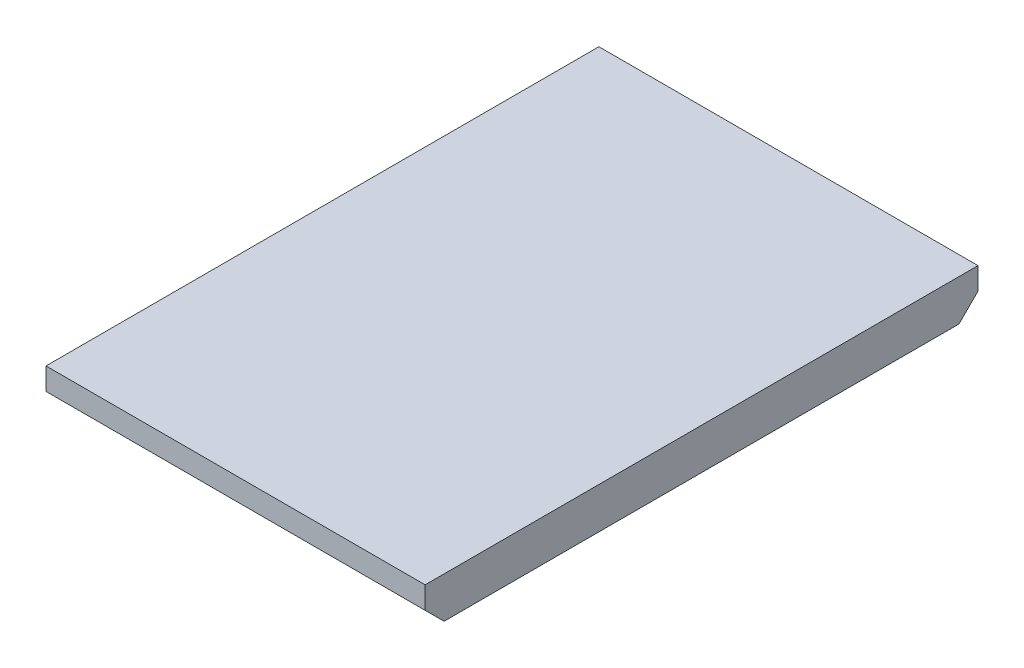
ISO-10303-21;
HEADER;
FILE_DESCRIPTION(('STEP AP214'),'2;1');
FILE_NAME('part.step','',(''),(''),'','','');
FILE_SCHEMA(('AUTOMOTIVE_DESIGN { 1 0 10303 214 1 1 1 1 }'));
ENDSEC;
DATA;
#1=APPLICATION_CONTEXT('core data for automotive mechanical design processes');
#2=APPLICATION_PROTOCOL_DEFINITION('international standard','automotive_design',2000,#1);
#3=PRODUCT_CONTEXT('',#1,'mechanical');
#4=PRODUCT('Part','Part','',(#3));
#5=PRODUCT_RELATED_PRODUCT_CATEGORY('part','',(#4));
#6=PRODUCT_DEFINITION_FORMATION('','',#4);
#7=PRODUCT_DEFINITION_CONTEXT('part definition',#1,'design');
#8=PRODUCT_DEFINITION('design','',#6,#7);
#9=PRODUCT_DEFINITION_SHAPE('','',#8);
#10=(LENGTH_UNIT() NAMED_UNIT(*) SI_UNIT(.MILLI.,.METRE.));
#11=(NAMED_UNIT(*) PLANE_ANGLE_UNIT() SI_UNIT($,.RADIAN.));
#12=(NAMED_UNIT(*) SI_UNIT($,.STERADIAN.) SOLID_ANGLE_UNIT());
#13=UNCERTAINTY_MEASURE_WITH_UNIT(LENGTH_MEASURE(1.E-05),#10,'distance_accuracy_value','');
#14=(GEOMETRIC_REPRESENTATION_CONTEXT(3) GLOBAL_UNCERTAINTY_ASSIGNED_CONTEXT((#13)) GLOBAL_UNIT_ASSIGNED_CONTEXT((#10,
#11,#12)) REPRESENTATION_CONTEXT('',''));
#15=CARTESIAN_POINT('',(0.,0.,0.));
#16=DIRECTION('',(0.,0.,1.));
#17=DIRECTION('',(1.,0.,0.));
#18=AXIS2_PLACEMENT_3D('',#15,#16,#17);
#19=CARTESIAN_POINT('',(12.,-1.4,-17.5));
#20=DIRECTION('',(0.,0.,1.));
#21=DIRECTION('',(1.,0.,0.));
#22=AXIS2_PLACEMENT_3D('',#19,#20,#21);
#23=PLANE('',#22);
#24=DIRECTION('',(0.,1.,0.));
#25=VECTOR('',#24,1.);
#26=CARTESIAN_POINT('',(-12.,-1.4,-17.5));
#27=LINE('',#26,#25);
#28=CARTESIAN_POINT('',(-12.,-1.4,-17.5));
#29=VERTEX_POINT('',#28);
#30=CARTESIAN_POINT('',(-12.,0.,-17.5));
#31=VERTEX_POINT('',#30);
#32=EDGE_CURVE('E121',#29,#31,#27,.T.);
#33=ORIENTED_EDGE('',*,*,#32,.T.);
#34=DIRECTION('',(-1.,0.,0.));
#35=VECTOR('',#34,1.);
#36=CARTESIAN_POINT('',(12.,0.,-17.5));
#37=LINE('',#36,#35);
#38=CARTESIAN_POINT('',(12.,0.,-17.5));
#39=VERTEX_POINT('',#38);
#40=EDGE_CURVE('E11',#39,#31,#37,.T.);
#41=ORIENTED_EDGE('',*,*,#40,.F.);
#42=DIRECTION('',(0.,1.,0.));
#43=VECTOR('',#42,1.);
#44=CARTESIAN_POINT('',(12.,-1.4,-17.5));
#45=LINE('',#44,#43);
#46=CARTESIAN_POINT('',(12.,-1.4,-17.5));
#47=VERTEX_POINT('',#46);
#48=EDGE_CURVE('E131',#47,#39,#45,.T.);
#49=ORIENTED_EDGE('',*,*,#48,.F.);
#50=DIRECTION('',(-1.,0.,0.));
#51=VECTOR('',#50,1.);
#52=CARTESIAN_POINT('',(12.,-1.4,-17.5));
#53=LINE('',#52,#51);
#54=EDGE_CURVE('E117',#47,#29,#53,.T.);
#55=ORIENTED_EDGE('',*,*,#54,.T.);
#56=EDGE_LOOP('',(#33,#41,#49,#55));
#57=FACE_BOUND('',#56,.T.);
#58=ADVANCED_FACE('F37',(#57),#23,.F.);
#59=CARTESIAN_POINT('',(12.,0.,-17.5));
#60=DIRECTION('',(0.,-1.,0.));
#61=DIRECTION('',(0.,0.,-1.));
#62=AXIS2_PLACEMENT_3D('',#59,#60,#61);
#63=PLANE('',#62);
#64=DIRECTION('',(0.,0.,1.));
#65=VECTOR('',#64,1.);
#66=CARTESIAN_POINT('',(-12.,0.,-17.5));
#67=LINE('',#66,#65);
#68=CARTESIAN_POINT('',(-12.,0.,17.5));
#69=VERTEX_POINT('',#68);
#70=EDGE_CURVE('E124',#31,#69,#67,.T.);
#71=ORIENTED_EDGE('',*,*,#70,.T.);
#72=DIRECTION('',(-1.,0.,0.));
#73=VECTOR('',#72,1.);
#74=CARTESIAN_POINT('',(12.,0.,17.5));
#75=LINE('',#74,#73);
#76=CARTESIAN_POINT('',(12.,0.,17.5));
#77=VERTEX_POINT('',#76);
#78=EDGE_CURVE('E45',#77,#69,#75,.T.);
#79=ORIENTED_EDGE('',*,*,#78,.F.);
#80=DIRECTION('',(0.,0.,1.));
#81=VECTOR('',#80,1.);
#82=CARTESIAN_POINT('',(12.,0.,-17.5));
#83=LINE('',#82,#81);
#84=EDGE_CURVE('E90',#39,#77,#83,.T.);
#85=ORIENTED_EDGE('',*,*,#84,.F.);
#86=ORIENTED_EDGE('',*,*,#40,.T.);
#87=EDGE_LOOP('',(#71,#79,#85,#86));
#88=FACE_BOUND('',#87,.T.);
#89=ADVANCED_FACE('F155',(#88),#63,.F.);
#90=CARTESIAN_POINT('',(12.,0.,17.5));
#91=DIRECTION('',(0.,0.,-1.));
#92=DIRECTION('',(-1.,0.,0.));
#93=AXIS2_PLACEMENT_3D('',#90,#91,#92);
#94=PLANE('',#93);
#95=DIRECTION('',(0.,-1.,0.));
#96=VECTOR('',#95,1.);
#97=CARTESIAN_POINT('',(-12.,0.,17.5));
#98=LINE('',#97,#96);
#99=CARTESIAN_POINT('',(-12.,-1.4,17.5));
#100=VERTEX_POINT('',#99);
#101=EDGE_CURVE('E126',#69,#100,#98,.T.);
#102=ORIENTED_EDGE('',*,*,#101,.T.);
#103=DIRECTION('',(-1.,0.,0.));
#104=VECTOR('',#103,1.);
#105=CARTESIAN_POINT('',(12.,-1.4,17.5));
#106=LINE('',#105,#104);
#107=CARTESIAN_POINT('',(12.,-1.4,17.5));
#108=VERTEX_POINT('',#107);
#109=EDGE_CURVE('E112',#108,#100,#106,.T.);
#110=ORIENTED_EDGE('',*,*,#109,.F.);
#111=DIRECTION('',(0.,-1.,0.));
#112=VECTOR('',#111,1.);
#113=CARTESIAN_POINT('',(12.,0.,17.5));
#114=LINE('',#113,#112);
#115=EDGE_CURVE('E103',#77,#108,#114,.T.);
#116=ORIENTED_EDGE('',*,*,#115,.F.);
#117=ORIENTED_EDGE('',*,*,#78,.T.);
#118=EDGE_LOOP('',(#102,#110,#116,#117));
#119=FACE_BOUND('',#118,.T.);
#120=ADVANCED_FACE('F137',(#119),#94,.F.);
#121=CARTESIAN_POINT('',(12.,-1.4,17.5));
#122=DIRECTION('',(0.,0.707106781186548,-0.707106781186548));
#123=DIRECTION('',(0.,0.707106781186548,0.707106781186548));
#124=AXIS2_PLACEMENT_3D('',#121,#122,#123);
#125=PLANE('',#124);
#126=DIRECTION('',(0.,-0.707106781186547,-0.707106781186547));
#127=VECTOR('',#126,1.);
#128=CARTESIAN_POINT('',(-12.,-1.4,17.5));
#129=LINE('',#128,#127);
#130=CARTESIAN_POINT('',(-12.,-2.6,16.3));
#131=VERTEX_POINT('',#130);
#132=EDGE_CURVE('E111',#100,#131,#129,.T.);
#133=ORIENTED_EDGE('',*,*,#132,.T.);
#134=DIRECTION('',(-1.,0.,0.));
#135=VECTOR('',#134,1.);
#136=CARTESIAN_POINT('',(12.,-2.6,16.3));
#137=LINE('',#136,#135);
#138=CARTESIAN_POINT('',(12.,-2.6,16.3));
#139=VERTEX_POINT('',#138);
#140=EDGE_CURVE('E108',#139,#131,#137,.T.);
#141=ORIENTED_EDGE('',*,*,#140,.F.);
#142=DIRECTION('',(0.,-0.707106781186547,-0.707106781186547));
#143=VECTOR('',#142,1.);
#144=CARTESIAN_POINT('',(12.,-1.4,17.5));
#145=LINE('',#144,#143);
#146=EDGE_CURVE('E97',#108,#139,#145,.T.);
#147=ORIENTED_EDGE('',*,*,#146,.F.);
#148=ORIENTED_EDGE('',*,*,#109,.T.);
#149=EDGE_LOOP('',(#133,#141,#147,#148));
#150=FACE_BOUND('',#149,.T.);
#151=ADVANCED_FACE('F109',(#150),#125,.F.);
#152=CARTESIAN_POINT('',(12.,-2.6,16.3));
#153=DIRECTION('',(0.,1.,0.));
#154=DIRECTION('',(0.,0.,1.));
#155=AXIS2_PLACEMENT_3D('',#152,#153,#154);
#156=PLANE('',#155);
#157=DIRECTION('',(0.,0.,-1.));
#158=VECTOR('',#157,1.);
#159=CARTESIAN_POINT('',(-12.,-2.6,16.3));
#160=LINE('',#159,#158);
#161=CARTESIAN_POINT('',(-12.,-2.6,-16.3));
#162=VERTEX_POINT('',#161);
#163=EDGE_CURVE('E76',#131,#162,#160,.T.);
#164=ORIENTED_EDGE('',*,*,#163,.T.);
#165=DIRECTION('',(-1.,0.,0.));
#166=VECTOR('',#165,1.);
#167=CARTESIAN_POINT('',(12.,-2.6,-16.3));
#168=LINE('',#167,#166);
#169=CARTESIAN_POINT('',(12.,-2.6,-16.3));
#170=VERTEX_POINT('',#169);
#171=EDGE_CURVE('E113',#170,#162,#168,.T.);
#172=ORIENTED_EDGE('',*,*,#171,.F.);
#173=DIRECTION('',(0.,0.,-1.));
#174=VECTOR('',#173,1.);
#175=CARTESIAN_POINT('',(12.,-2.6,16.3));
#176=LINE('',#175,#174);
#177=EDGE_CURVE('E101',#139,#170,#176,.T.);
#178=ORIENTED_EDGE('',*,*,#177,.F.);
#179=ORIENTED_EDGE('',*,*,#140,.T.);
#180=EDGE_LOOP('',(#164,#172,#178,#179));
#181=FACE_BOUND('',#180,.T.);
#182=ADVANCED_FACE('F115',(#181),#156,.F.);
#183=CARTESIAN_POINT('',(12.,-2.6,-16.3));
#184=DIRECTION('',(0.,0.707106781186548,0.707106781186548));
#185=DIRECTION('',(0.,-0.707106781186548,0.707106781186548));
#186=AXIS2_PLACEMENT_3D('',#183,#184,#185);
#187=PLANE('',#186);
#188=DIRECTION('',(0.,0.707106781186547,-0.707106781186547));
#189=VECTOR('',#188,1.);
#190=CARTESIAN_POINT('',(-12.,-2.6,-16.3));
#191=LINE('',#190,#189);
#192=EDGE_CURVE('E82',#162,#29,#191,.T.);
#193=ORIENTED_EDGE('',*,*,#192,.T.);
#194=ORIENTED_EDGE('',*,*,#54,.F.);
#195=DIRECTION('',(0.,0.707106781186547,-0.707106781186547));
#196=VECTOR('',#195,1.);
#197=CARTESIAN_POINT('',(12.,-2.6,-16.3));
#198=LINE('',#197,#196);
#199=EDGE_CURVE('E53',#170,#47,#198,.T.);
#200=ORIENTED_EDGE('',*,*,#199,.F.);
#201=ORIENTED_EDGE('',*,*,#171,.T.);
#202=EDGE_LOOP('',(#193,#194,#200,#201));
#203=FACE_BOUND('',#202,.T.);
#204=ADVANCED_FACE('F144',(#203),#187,.F.);
#205=CARTESIAN_POINT('',(12.,0.,0.));
#206=DIRECTION('',(1.,0.,0.));
#207=DIRECTION('',(0.,0.,-1.));
#208=AXIS2_PLACEMENT_3D('',#205,#206,#207);
#209=PLANE('',#208);
#210=ORIENTED_EDGE('',*,*,#48,.T.);
#211=ORIENTED_EDGE('',*,*,#84,.T.);
#212=ORIENTED_EDGE('',*,*,#115,.T.);
#213=ORIENTED_EDGE('',*,*,#146,.T.);
#214=ORIENTED_EDGE('',*,*,#177,.T.);
#215=ORIENTED_EDGE('',*,*,#199,.T.);
#216=EDGE_LOOP('',(#210,#211,#212,#213,#214,#215));
#217=FACE_BOUND('',#216,.T.);
#218=ADVANCED_FACE('F99',(#217),#209,.T.);
#219=CARTESIAN_POINT('',(-12.,0.,0.));
#220=DIRECTION('',(1.,0.,0.));
#221=DIRECTION('',(0.,0.,-1.));
#222=AXIS2_PLACEMENT_3D('',#219,#220,#221);
#223=PLANE('',#222);
#224=ORIENTED_EDGE('',*,*,#32,.F.);
#225=ORIENTED_EDGE('',*,*,#192,.F.);
#226=ORIENTED_EDGE('',*,*,#163,.F.);
#227=ORIENTED_EDGE('',*,*,#132,.F.);
#228=ORIENTED_EDGE('',*,*,#101,.F.);
#229=ORIENTED_EDGE('',*,*,#70,.F.);
#230=EDGE_LOOP('',(#224,#225,#226,#227,#228,#229));
#231=FACE_BOUND('',#230,.T.);
#232=ADVANCED_FACE('F140',(#231),#223,.F.);
#233=CLOSED_SHELL('',(#58,#89,#120,#151,#182,#204,#218,#232));
#234=MANIFOLD_SOLID_BREP('B2',#233);
#235=ADVANCED_BREP_SHAPE_REPRESENTATION('',(#18,#234),#14);
#236=SHAPE_DEFINITION_REPRESENTATION(#9,#235);
ENDSEC;
END-ISO-10303-21;
